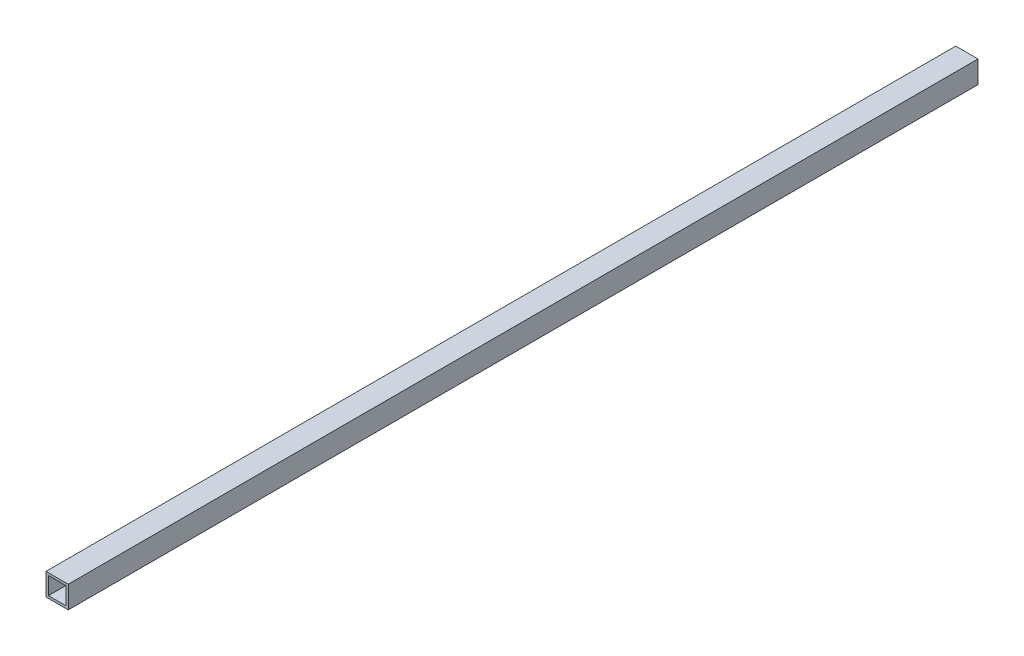
ISO-10303-21;
HEADER;
FILE_DESCRIPTION(('STEP AP214'),'2;1');
FILE_NAME('part.step','',(''),(''),'','','');
FILE_SCHEMA(('AUTOMOTIVE_DESIGN { 1 0 10303 214 1 1 1 1 }'));
ENDSEC;
DATA;
#1=APPLICATION_CONTEXT('core data for automotive mechanical design processes');
#2=APPLICATION_PROTOCOL_DEFINITION('international standard','automotive_design',2000,#1);
#3=PRODUCT_CONTEXT('',#1,'mechanical');
#4=PRODUCT('Part','Part','',(#3));
#5=PRODUCT_RELATED_PRODUCT_CATEGORY('part','',(#4));
#6=PRODUCT_DEFINITION_FORMATION('','',#4);
#7=PRODUCT_DEFINITION_CONTEXT('part definition',#1,'design');
#8=PRODUCT_DEFINITION('design','',#6,#7);
#9=PRODUCT_DEFINITION_SHAPE('','',#8);
#10=(LENGTH_UNIT() NAMED_UNIT(*) SI_UNIT(.MILLI.,.METRE.));
#11=(NAMED_UNIT(*) PLANE_ANGLE_UNIT() SI_UNIT($,.RADIAN.));
#12=(NAMED_UNIT(*) SI_UNIT($,.STERADIAN.) SOLID_ANGLE_UNIT());
#13=UNCERTAINTY_MEASURE_WITH_UNIT(LENGTH_MEASURE(1.E-05),#10,'distance_accuracy_value','');
#14=(GEOMETRIC_REPRESENTATION_CONTEXT(3) GLOBAL_UNCERTAINTY_ASSIGNED_CONTEXT((#13)) GLOBAL_UNIT_ASSIGNED_CONTEXT((#10,
#11,#12)) REPRESENTATION_CONTEXT('',''));
#15=CARTESIAN_POINT('',(0.,0.,0.));
#16=DIRECTION('',(0.,0.,1.));
#17=DIRECTION('',(1.,0.,0.));
#18=AXIS2_PLACEMENT_3D('',#15,#16,#17);
#19=CARTESIAN_POINT('',(0.,0.,572.));
#20=DIRECTION('',(0.,0.,1.));
#21=DIRECTION('',(1.,0.,0.));
#22=AXIS2_PLACEMENT_3D('',#19,#20,#21);
#23=PLANE('',#22);
#24=DIRECTION('',(0.,1.,0.));
#25=VECTOR('',#24,1.);
#26=CARTESIAN_POINT('',(7.,5.5,572.));
#27=LINE('',#26,#25);
#28=CARTESIAN_POINT('',(7.,-7.,572.));
#29=VERTEX_POINT('',#28);
#30=CARTESIAN_POINT('',(7.,7.,572.));
#31=VERTEX_POINT('',#30);
#32=EDGE_CURVE('E157',#29,#31,#27,.T.);
#33=ORIENTED_EDGE('',*,*,#32,.T.);
#34=DIRECTION('',(-1.,0.,0.));
#35=VECTOR('',#34,1.);
#36=CARTESIAN_POINT('',(-5.5,7.,572.));
#37=LINE('',#36,#35);
#38=CARTESIAN_POINT('',(-7.,7.,572.));
#39=VERTEX_POINT('',#38);
#40=EDGE_CURVE('E160',#31,#39,#37,.T.);
#41=ORIENTED_EDGE('',*,*,#40,.T.);
#42=DIRECTION('',(0.,-1.,0.));
#43=VECTOR('',#42,1.);
#44=CARTESIAN_POINT('',(-7.,5.5,572.));
#45=LINE('',#44,#43);
#46=CARTESIAN_POINT('',(-7.,-7.,572.));
#47=VERTEX_POINT('',#46);
#48=EDGE_CURVE('E163',#39,#47,#45,.T.);
#49=ORIENTED_EDGE('',*,*,#48,.T.);
#50=DIRECTION('',(1.,0.,0.));
#51=VECTOR('',#50,1.);
#52=CARTESIAN_POINT('',(-5.5,-7.,572.));
#53=LINE('',#52,#51);
#54=EDGE_CURVE('E165',#47,#29,#53,.T.);
#55=ORIENTED_EDGE('',*,*,#54,.T.);
#56=EDGE_LOOP('',(#33,#41,#49,#55));
#57=FACE_BOUND('',#56,.T.);
#58=DIRECTION('',(-1.,0.,0.));
#59=VECTOR('',#58,1.);
#60=CARTESIAN_POINT('',(-5.5,5.5,572.));
#61=LINE('',#60,#59);
#62=CARTESIAN_POINT('',(5.5,5.5,572.));
#63=VERTEX_POINT('',#62);
#64=CARTESIAN_POINT('',(-5.5,5.5,572.));
#65=VERTEX_POINT('',#64);
#66=EDGE_CURVE('E129',#63,#65,#61,.T.);
#67=ORIENTED_EDGE('',*,*,#66,.F.);
#68=DIRECTION('',(0.,1.,0.));
#69=VECTOR('',#68,1.);
#70=CARTESIAN_POINT('',(5.5,5.5,572.));
#71=LINE('',#70,#69);
#72=CARTESIAN_POINT('',(5.5,-5.5,572.));
#73=VERTEX_POINT('',#72);
#74=EDGE_CURVE('E121',#73,#63,#71,.T.);
#75=ORIENTED_EDGE('',*,*,#74,.F.);
#76=DIRECTION('',(1.,0.,0.));
#77=VECTOR('',#76,1.);
#78=CARTESIAN_POINT('',(-5.5,-5.5,572.));
#79=LINE('',#78,#77);
#80=CARTESIAN_POINT('',(-5.5,-5.5,572.));
#81=VERTEX_POINT('',#80);
#82=EDGE_CURVE('E143',#81,#73,#79,.T.);
#83=ORIENTED_EDGE('',*,*,#82,.F.);
#84=DIRECTION('',(0.,-1.,0.));
#85=VECTOR('',#84,1.);
#86=CARTESIAN_POINT('',(-5.5,5.5,572.));
#87=LINE('',#86,#85);
#88=EDGE_CURVE('E141',#65,#81,#87,.T.);
#89=ORIENTED_EDGE('',*,*,#88,.F.);
#90=EDGE_LOOP('',(#67,#75,#83,#89));
#91=FACE_BOUND('',#90,.T.);
#92=ADVANCED_FACE('F56',(#57,#91),#23,.T.);
#93=CARTESIAN_POINT('',(0.,0.,0.));
#94=DIRECTION('',(0.,0.,1.));
#95=DIRECTION('',(1.,0.,0.));
#96=AXIS2_PLACEMENT_3D('',#93,#94,#95);
#97=PLANE('',#96);
#98=DIRECTION('',(0.,1.,0.));
#99=VECTOR('',#98,1.);
#100=CARTESIAN_POINT('',(7.,5.5,0.));
#101=LINE('',#100,#99);
#102=CARTESIAN_POINT('',(7.,-7.,0.));
#103=VERTEX_POINT('',#102);
#104=CARTESIAN_POINT('',(7.,7.,0.));
#105=VERTEX_POINT('',#104);
#106=EDGE_CURVE('E137',#103,#105,#101,.T.);
#107=ORIENTED_EDGE('',*,*,#106,.F.);
#108=DIRECTION('',(1.,0.,0.));
#109=VECTOR('',#108,1.);
#110=CARTESIAN_POINT('',(-5.5,-7.,0.));
#111=LINE('',#110,#109);
#112=CARTESIAN_POINT('',(-7.,-7.,0.));
#113=VERTEX_POINT('',#112);
#114=EDGE_CURVE('E161',#113,#103,#111,.T.);
#115=ORIENTED_EDGE('',*,*,#114,.F.);
#116=DIRECTION('',(0.,-1.,0.));
#117=VECTOR('',#116,1.);
#118=CARTESIAN_POINT('',(-7.,5.5,0.));
#119=LINE('',#118,#117);
#120=CARTESIAN_POINT('',(-7.,7.,0.));
#121=VERTEX_POINT('',#120);
#122=EDGE_CURVE('E172',#121,#113,#119,.T.);
#123=ORIENTED_EDGE('',*,*,#122,.F.);
#124=DIRECTION('',(-1.,0.,0.));
#125=VECTOR('',#124,1.);
#126=CARTESIAN_POINT('',(-5.5,7.,0.));
#127=LINE('',#126,#125);
#128=EDGE_CURVE('E170',#105,#121,#127,.T.);
#129=ORIENTED_EDGE('',*,*,#128,.F.);
#130=EDGE_LOOP('',(#107,#115,#123,#129));
#131=FACE_BOUND('',#130,.T.);
#132=DIRECTION('',(0.,1.,0.));
#133=VECTOR('',#132,1.);
#134=CARTESIAN_POINT('',(5.5,5.5,0.));
#135=LINE('',#134,#133);
#136=CARTESIAN_POINT('',(5.5,-5.5,0.));
#137=VERTEX_POINT('',#136);
#138=CARTESIAN_POINT('',(5.5,5.5,0.));
#139=VERTEX_POINT('',#138);
#140=EDGE_CURVE('E79',#137,#139,#135,.T.);
#141=ORIENTED_EDGE('',*,*,#140,.T.);
#142=DIRECTION('',(-1.,0.,0.));
#143=VECTOR('',#142,1.);
#144=CARTESIAN_POINT('',(-5.5,5.5,0.));
#145=LINE('',#144,#143);
#146=CARTESIAN_POINT('',(-5.5,5.5,0.));
#147=VERTEX_POINT('',#146);
#148=EDGE_CURVE('E136',#139,#147,#145,.T.);
#149=ORIENTED_EDGE('',*,*,#148,.T.);
#150=DIRECTION('',(0.,-1.,0.));
#151=VECTOR('',#150,1.);
#152=CARTESIAN_POINT('',(-5.5,5.5,0.));
#153=LINE('',#152,#151);
#154=CARTESIAN_POINT('',(-5.5,-5.5,0.));
#155=VERTEX_POINT('',#154);
#156=EDGE_CURVE('E149',#147,#155,#153,.T.);
#157=ORIENTED_EDGE('',*,*,#156,.T.);
#158=DIRECTION('',(1.,0.,0.));
#159=VECTOR('',#158,1.);
#160=CARTESIAN_POINT('',(-5.5,-5.5,0.));
#161=LINE('',#160,#159);
#162=EDGE_CURVE('E130',#155,#137,#161,.T.);
#163=ORIENTED_EDGE('',*,*,#162,.T.);
#164=EDGE_LOOP('',(#141,#149,#157,#163));
#165=FACE_BOUND('',#164,.T.);
#166=ADVANCED_FACE('F190',(#131,#165),#97,.F.);
#167=CARTESIAN_POINT('',(7.,5.5,572.));
#168=DIRECTION('',(-1.,0.,0.));
#169=DIRECTION('',(0.,-1.,0.));
#170=AXIS2_PLACEMENT_3D('',#167,#168,#169);
#171=PLANE('',#170);
#172=ORIENTED_EDGE('',*,*,#106,.T.);
#173=DIRECTION('',(0.,0.,-1.));
#174=VECTOR('',#173,1.);
#175=CARTESIAN_POINT('',(7.,7.,572.));
#176=LINE('',#175,#174);
#177=EDGE_CURVE('E12',#31,#105,#176,.T.);
#178=ORIENTED_EDGE('',*,*,#177,.F.);
#179=ORIENTED_EDGE('',*,*,#32,.F.);
#180=DIRECTION('',(0.,0.,-1.));
#181=VECTOR('',#180,1.);
#182=CARTESIAN_POINT('',(7.,-7.,572.));
#183=LINE('',#182,#181);
#184=EDGE_CURVE('E167',#29,#103,#183,.T.);
#185=ORIENTED_EDGE('',*,*,#184,.T.);
#186=EDGE_LOOP('',(#172,#178,#179,#185));
#187=FACE_BOUND('',#186,.T.);
#188=ADVANCED_FACE('F58',(#187),#171,.F.);
#189=CARTESIAN_POINT('',(-5.5,7.,572.));
#190=DIRECTION('',(0.,-1.,0.));
#191=DIRECTION('',(0.,0.,-1.));
#192=AXIS2_PLACEMENT_3D('',#189,#190,#191);
#193=PLANE('',#192);
#194=ORIENTED_EDGE('',*,*,#128,.T.);
#195=DIRECTION('',(0.,0.,-1.));
#196=VECTOR('',#195,1.);
#197=CARTESIAN_POINT('',(-7.,7.,572.));
#198=LINE('',#197,#196);
#199=EDGE_CURVE('E64',#39,#121,#198,.T.);
#200=ORIENTED_EDGE('',*,*,#199,.F.);
#201=ORIENTED_EDGE('',*,*,#40,.F.);
#202=ORIENTED_EDGE('',*,*,#177,.T.);
#203=EDGE_LOOP('',(#194,#200,#201,#202));
#204=FACE_BOUND('',#203,.T.);
#205=ADVANCED_FACE('F200',(#204),#193,.F.);
#206=CARTESIAN_POINT('',(-7.,5.5,572.));
#207=DIRECTION('',(1.,0.,0.));
#208=DIRECTION('',(0.,1.,0.));
#209=AXIS2_PLACEMENT_3D('',#206,#207,#208);
#210=PLANE('',#209);
#211=ORIENTED_EDGE('',*,*,#122,.T.);
#212=DIRECTION('',(0.,0.,-1.));
#213=VECTOR('',#212,1.);
#214=CARTESIAN_POINT('',(-7.,-7.,572.));
#215=LINE('',#214,#213);
#216=EDGE_CURVE('E177',#47,#113,#215,.T.);
#217=ORIENTED_EDGE('',*,*,#216,.F.);
#218=ORIENTED_EDGE('',*,*,#48,.F.);
#219=ORIENTED_EDGE('',*,*,#199,.T.);
#220=EDGE_LOOP('',(#211,#217,#218,#219));
#221=FACE_BOUND('',#220,.T.);
#222=ADVANCED_FACE('F184',(#221),#210,.F.);
#223=CARTESIAN_POINT('',(-5.5,-7.,572.));
#224=DIRECTION('',(0.,1.,0.));
#225=DIRECTION('',(0.,0.,1.));
#226=AXIS2_PLACEMENT_3D('',#223,#224,#225);
#227=PLANE('',#226);
#228=ORIENTED_EDGE('',*,*,#114,.T.);
#229=ORIENTED_EDGE('',*,*,#184,.F.);
#230=ORIENTED_EDGE('',*,*,#54,.F.);
#231=ORIENTED_EDGE('',*,*,#216,.T.);
#232=EDGE_LOOP('',(#228,#229,#230,#231));
#233=FACE_BOUND('',#232,.T.);
#234=ADVANCED_FACE('F194',(#233),#227,.F.);
#235=CARTESIAN_POINT('',(5.5,5.5,572.));
#236=DIRECTION('',(-1.,0.,0.));
#237=DIRECTION('',(0.,-1.,0.));
#238=AXIS2_PLACEMENT_3D('',#235,#236,#237);
#239=PLANE('',#238);
#240=ORIENTED_EDGE('',*,*,#140,.F.);
#241=DIRECTION('',(0.,0.,-1.));
#242=VECTOR('',#241,1.);
#243=CARTESIAN_POINT('',(5.5,-5.5,572.));
#244=LINE('',#243,#242);
#245=EDGE_CURVE('E125',#73,#137,#244,.T.);
#246=ORIENTED_EDGE('',*,*,#245,.F.);
#247=ORIENTED_EDGE('',*,*,#74,.T.);
#248=DIRECTION('',(0.,0.,-1.));
#249=VECTOR('',#248,1.);
#250=CARTESIAN_POINT('',(5.5,5.5,572.));
#251=LINE('',#250,#249);
#252=EDGE_CURVE('E124',#63,#139,#251,.T.);
#253=ORIENTED_EDGE('',*,*,#252,.T.);
#254=EDGE_LOOP('',(#240,#246,#247,#253));
#255=FACE_BOUND('',#254,.T.);
#256=ADVANCED_FACE('F123',(#255),#239,.T.);
#257=CARTESIAN_POINT('',(-5.5,5.5,572.));
#258=DIRECTION('',(0.,-1.,0.));
#259=DIRECTION('',(0.,0.,-1.));
#260=AXIS2_PLACEMENT_3D('',#257,#258,#259);
#261=PLANE('',#260);
#262=ORIENTED_EDGE('',*,*,#148,.F.);
#263=ORIENTED_EDGE('',*,*,#252,.F.);
#264=ORIENTED_EDGE('',*,*,#66,.T.);
#265=DIRECTION('',(0.,0.,-1.));
#266=VECTOR('',#265,1.);
#267=CARTESIAN_POINT('',(-5.5,5.5,572.));
#268=LINE('',#267,#266);
#269=EDGE_CURVE('E138',#65,#147,#268,.T.);
#270=ORIENTED_EDGE('',*,*,#269,.T.);
#271=EDGE_LOOP('',(#262,#263,#264,#270));
#272=FACE_BOUND('',#271,.T.);
#273=ADVANCED_FACE('F133',(#272),#261,.T.);
#274=CARTESIAN_POINT('',(-5.5,5.5,572.));
#275=DIRECTION('',(1.,0.,0.));
#276=DIRECTION('',(0.,1.,0.));
#277=AXIS2_PLACEMENT_3D('',#274,#275,#276);
#278=PLANE('',#277);
#279=ORIENTED_EDGE('',*,*,#156,.F.);
#280=ORIENTED_EDGE('',*,*,#269,.F.);
#281=ORIENTED_EDGE('',*,*,#88,.T.);
#282=DIRECTION('',(0.,0.,-1.));
#283=VECTOR('',#282,1.);
#284=CARTESIAN_POINT('',(-5.5,-5.5,572.));
#285=LINE('',#284,#283);
#286=EDGE_CURVE('E71',#81,#155,#285,.T.);
#287=ORIENTED_EDGE('',*,*,#286,.T.);
#288=EDGE_LOOP('',(#279,#280,#281,#287));
#289=FACE_BOUND('',#288,.T.);
#290=ADVANCED_FACE('F223',(#289),#278,.T.);
#291=CARTESIAN_POINT('',(-5.5,-5.5,572.));
#292=DIRECTION('',(0.,1.,0.));
#293=DIRECTION('',(0.,0.,1.));
#294=AXIS2_PLACEMENT_3D('',#291,#292,#293);
#295=PLANE('',#294);
#296=ORIENTED_EDGE('',*,*,#162,.F.);
#297=ORIENTED_EDGE('',*,*,#286,.F.);
#298=ORIENTED_EDGE('',*,*,#82,.T.);
#299=ORIENTED_EDGE('',*,*,#245,.T.);
#300=EDGE_LOOP('',(#296,#297,#298,#299));
#301=FACE_BOUND('',#300,.T.);
#302=ADVANCED_FACE('F227',(#301),#295,.T.);
#303=CLOSED_SHELL('',(#92,#166,#188,#205,#222,#234,#256,#273,#290,#302));
#304=MANIFOLD_SOLID_BREP('B2',#303);
#305=ADVANCED_BREP_SHAPE_REPRESENTATION('',(#18,#304),#14);
#306=SHAPE_DEFINITION_REPRESENTATION(#9,#305);
ENDSEC;
END-ISO-10303-21;
